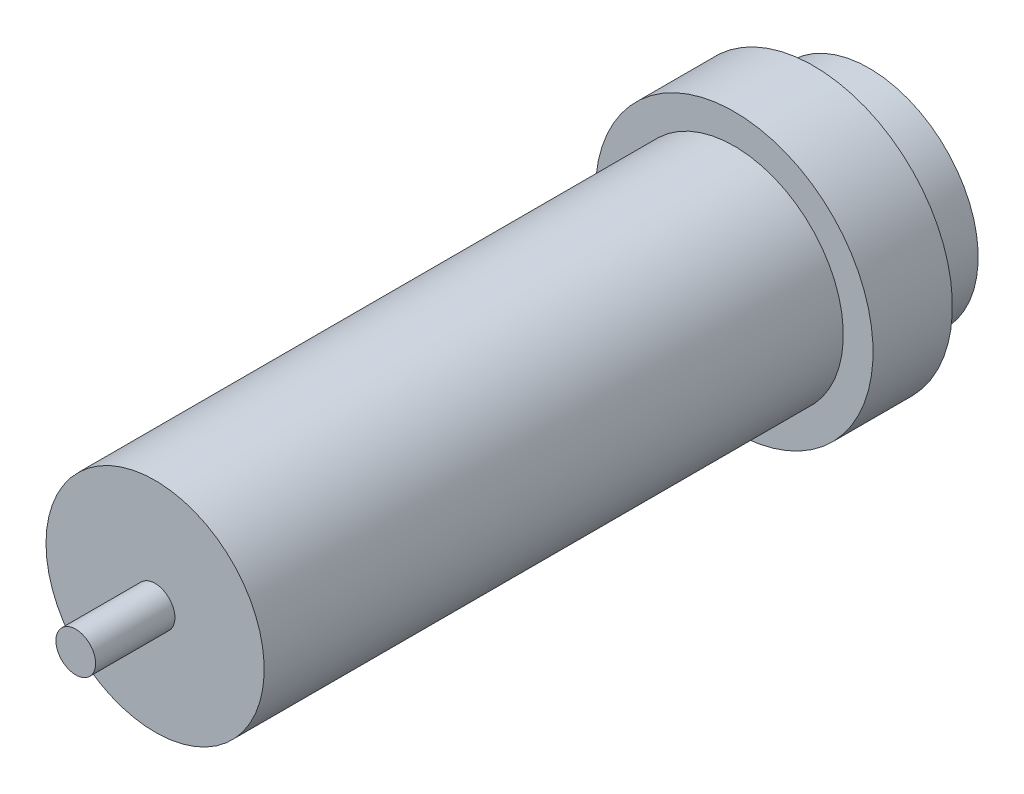
ISO-10303-21;
HEADER;
FILE_DESCRIPTION(('STEP AP214'),'2;1');
FILE_NAME('part.step','',(''),(''),'','','');
FILE_SCHEMA(('AUTOMOTIVE_DESIGN { 1 0 10303 214 1 1 1 1 }'));
ENDSEC;
DATA;
#1=APPLICATION_CONTEXT('core data for automotive mechanical design processes');
#2=APPLICATION_PROTOCOL_DEFINITION('international standard','automotive_design',2000,#1);
#3=PRODUCT_CONTEXT('',#1,'mechanical');
#4=PRODUCT('Part','Part','',(#3));
#5=PRODUCT_RELATED_PRODUCT_CATEGORY('part','',(#4));
#6=PRODUCT_DEFINITION_FORMATION('','',#4);
#7=PRODUCT_DEFINITION_CONTEXT('part definition',#1,'design');
#8=PRODUCT_DEFINITION('design','',#6,#7);
#9=PRODUCT_DEFINITION_SHAPE('','',#8);
#10=(LENGTH_UNIT() NAMED_UNIT(*) SI_UNIT(.MILLI.,.METRE.));
#11=(NAMED_UNIT(*) PLANE_ANGLE_UNIT() SI_UNIT($,.RADIAN.));
#12=(NAMED_UNIT(*) SI_UNIT($,.STERADIAN.) SOLID_ANGLE_UNIT());
#13=UNCERTAINTY_MEASURE_WITH_UNIT(LENGTH_MEASURE(1.E-05),#10,'distance_accuracy_value','');
#14=(GEOMETRIC_REPRESENTATION_CONTEXT(3) GLOBAL_UNCERTAINTY_ASSIGNED_CONTEXT((#13)) GLOBAL_UNIT_ASSIGNED_CONTEXT((#10,
#11,#12)) REPRESENTATION_CONTEXT('',''));
#15=CARTESIAN_POINT('',(0.,0.,0.));
#16=DIRECTION('',(0.,0.,1.));
#17=DIRECTION('',(1.,0.,0.));
#18=AXIS2_PLACEMENT_3D('',#15,#16,#17);
#19=CARTESIAN_POINT('',(0.,0.,2.5));
#20=DIRECTION('',(0.,0.,-1.));
#21=DIRECTION('',(-1.,0.,0.));
#22=AXIS2_PLACEMENT_3D('',#19,#20,#21);
#23=CYLINDRICAL_SURFACE('',#22,1.25);
#24=CARTESIAN_POINT('',(0.,0.,2.5));
#25=DIRECTION('',(0.,0.,1.));
#26=DIRECTION('',(1.,0.,0.));
#27=AXIS2_PLACEMENT_3D('',#24,#25,#26);
#28=CIRCLE('',#27,1.25);
#29=CARTESIAN_POINT('',(1.25,0.,2.5));
#30=VERTEX_POINT('',#29);
#31=EDGE_CURVE('E44',#30,#30,#28,.T.);
#32=ORIENTED_EDGE('',*,*,#31,.F.);
#33=EDGE_LOOP('',(#32));
#34=FACE_BOUND('',#33,.T.);
#35=CARTESIAN_POINT('',(0.,0.,0.));
#36=DIRECTION('',(0.,0.,1.));
#37=DIRECTION('',(1.,0.,0.));
#38=AXIS2_PLACEMENT_3D('',#35,#36,#37);
#39=CIRCLE('',#38,1.25);
#40=CARTESIAN_POINT('',(1.25,0.,0.));
#41=VERTEX_POINT('',#40);
#42=EDGE_CURVE('E58',#41,#41,#39,.T.);
#43=ORIENTED_EDGE('',*,*,#42,.T.);
#44=EDGE_LOOP('',(#43));
#45=FACE_BOUND('',#44,.T.);
#46=ADVANCED_FACE('F33',(#34,#45),#23,.T.);
#47=CARTESIAN_POINT('',(0.,0.,0.));
#48=DIRECTION('',(0.,0.,1.));
#49=DIRECTION('',(1.,0.,0.));
#50=AXIS2_PLACEMENT_3D('',#47,#48,#49);
#51=PLANE('',#50);
#52=ORIENTED_EDGE('',*,*,#42,.F.);
#53=EDGE_LOOP('',(#52));
#54=FACE_BOUND('',#53,.T.);
#55=ADVANCED_FACE('F94',(#54),#51,.F.);
#56=CARTESIAN_POINT('',(0.,0.,47.5));
#57=DIRECTION('',(0.,0.,-1.));
#58=DIRECTION('',(-1.,0.,0.));
#59=AXIS2_PLACEMENT_3D('',#56,#57,#58);
#60=CYLINDRICAL_SURFACE('',#59,6.875);
#61=CARTESIAN_POINT('',(0.,0.,6.));
#62=DIRECTION('',(0.,0.,-1.));
#63=DIRECTION('',(-1.,0.,0.));
#64=AXIS2_PLACEMENT_3D('',#61,#62,#63);
#65=CIRCLE('',#64,6.875);
#66=CARTESIAN_POINT('',(-6.875,0.,6.));
#67=VERTEX_POINT('',#66);
#68=EDGE_CURVE('E54',#67,#67,#65,.T.);
#69=CARTESIAN_POINT('',(0.,0.,2.5));
#70=DIRECTION('',(0.,0.,1.));
#71=DIRECTION('',(1.,0.,0.));
#72=AXIS2_PLACEMENT_3D('',#69,#70,#71);
#73=CIRCLE('',#72,6.875);
#74=CARTESIAN_POINT('',(-6.875,0.,2.5));
#75=VERTEX_POINT('',#74);
#76=EDGE_CURVE('E59',#75,#75,#73,.T.);
#77=CARTESIAN_POINT('',(-6.875,0.,6.));
#78=CARTESIAN_POINT('',(-6.875,0.,5.96354166666666));
#79=CARTESIAN_POINT('',(-6.875,0.,5.92708333333333));
#80=CARTESIAN_POINT('',(-6.875,0.,5.85416666666666));
#81=CARTESIAN_POINT('',(-6.875,0.,5.81770833333333));
#82=CARTESIAN_POINT('',(-6.875,0.,5.74479166666666));
#83=CARTESIAN_POINT('',(-6.875,0.,5.70833333333333));
#84=CARTESIAN_POINT('',(-6.875,0.,5.63541666666667));
#85=CARTESIAN_POINT('',(-6.875,0.,5.59895833333333));
#86=CARTESIAN_POINT('',(-6.875,0.,5.52604166666666));
#87=CARTESIAN_POINT('',(-6.875,0.,5.48958333333333));
#88=CARTESIAN_POINT('',(-6.875,0.,5.41666666666666));
#89=CARTESIAN_POINT('',(-6.875,0.,5.38020833333333));
#90=CARTESIAN_POINT('',(-6.875,0.,5.30729166666667));
#91=CARTESIAN_POINT('',(-6.875,0.,5.27083333333333));
#92=CARTESIAN_POINT('',(-6.875,0.,5.19791666666667));
#93=CARTESIAN_POINT('',(-6.875,0.,5.16145833333333));
#94=CARTESIAN_POINT('',(-6.875,0.,5.08854166666666));
#95=CARTESIAN_POINT('',(-6.875,0.,5.05208333333333));
#96=CARTESIAN_POINT('',(-6.875,0.,4.97916666666666));
#97=CARTESIAN_POINT('',(-6.875,0.,4.94270833333333));
#98=CARTESIAN_POINT('',(-6.875,0.,4.86979166666666));
#99=CARTESIAN_POINT('',(-6.875,0.,4.83333333333333));
#100=CARTESIAN_POINT('',(-6.875,0.,4.76041666666667));
#101=CARTESIAN_POINT('',(-6.875,0.,4.72395833333333));
#102=CARTESIAN_POINT('',(-6.875,0.,4.65104166666666));
#103=CARTESIAN_POINT('',(-6.875,0.,4.61458333333333));
#104=CARTESIAN_POINT('',(-6.875,0.,4.54166666666666));
#105=CARTESIAN_POINT('',(-6.875,0.,4.50520833333333));
#106=CARTESIAN_POINT('',(-6.875,0.,4.43229166666667));
#107=CARTESIAN_POINT('',(-6.875,0.,4.39583333333333));
#108=CARTESIAN_POINT('',(-6.875,0.,4.32291666666667));
#109=CARTESIAN_POINT('',(-6.875,0.,4.28645833333333));
#110=CARTESIAN_POINT('',(-6.875,0.,4.21354166666666));
#111=CARTESIAN_POINT('',(-6.875,0.,4.17708333333333));
#112=CARTESIAN_POINT('',(-6.875,0.,4.10416666666666));
#113=CARTESIAN_POINT('',(-6.875,0.,4.06770833333333));
#114=CARTESIAN_POINT('',(-6.875,0.,3.99479166666666));
#115=CARTESIAN_POINT('',(-6.875,0.,3.95833333333333));
#116=CARTESIAN_POINT('',(-6.875,0.,3.88541666666666));
#117=CARTESIAN_POINT('',(-6.875,0.,3.84895833333333));
#118=CARTESIAN_POINT('',(-6.875,0.,3.77604166666666));
#119=CARTESIAN_POINT('',(-6.875,0.,3.73958333333333));
#120=CARTESIAN_POINT('',(-6.875,0.,3.66666666666666));
#121=CARTESIAN_POINT('',(-6.875,0.,3.63020833333333));
#122=CARTESIAN_POINT('',(-6.875,0.,3.55729166666667));
#123=CARTESIAN_POINT('',(-6.875,0.,3.52083333333333));
#124=CARTESIAN_POINT('',(-6.875,0.,3.44791666666666));
#125=CARTESIAN_POINT('',(-6.875,0.,3.41145833333333));
#126=CARTESIAN_POINT('',(-6.875,0.,3.33854166666666));
#127=CARTESIAN_POINT('',(-6.875,0.,3.30208333333333));
#128=CARTESIAN_POINT('',(-6.875,0.,3.22916666666666));
#129=CARTESIAN_POINT('',(-6.875,0.,3.19270833333333));
#130=CARTESIAN_POINT('',(-6.875,0.,3.11979166666666));
#131=CARTESIAN_POINT('',(-6.875,0.,3.08333333333333));
#132=CARTESIAN_POINT('',(-6.875,0.,3.01041666666666));
#133=CARTESIAN_POINT('',(-6.875,0.,2.97395833333333));
#134=CARTESIAN_POINT('',(-6.875,0.,2.90104166666666));
#135=CARTESIAN_POINT('',(-6.875,0.,2.86458333333333));
#136=CARTESIAN_POINT('',(-6.875,0.,2.79166666666666));
#137=CARTESIAN_POINT('',(-6.875,0.,2.75520833333333));
#138=CARTESIAN_POINT('',(-6.875,0.,2.68229166666666));
#139=CARTESIAN_POINT('',(-6.875,0.,2.64583333333333));
#140=CARTESIAN_POINT('',(-6.875,0.,2.57291666666666));
#141=CARTESIAN_POINT('',(-6.875,0.,2.53645833333333));
#142=CARTESIAN_POINT('',(-6.875,0.,2.5));
#143=B_SPLINE_CURVE_WITH_KNOTS('',3,(#77,#78,#79,#80,#81,#82,#83,#84,#85,#86,#87,#88,#89,#90,
#91,#92,#93,#94,#95,#96,#97,#98,#99,#100,#101,#102,#103,#104,#105,#106,#107,#108,#109,#110,#111,
#112,#113,#114,#115,#116,#117,#118,#119,#120,#121,#122,#123,#124,#125,#126,#127,#128,#129,#130,
#131,#132,#133,#134,#135,#136,#137,#138,#139,#140,#141,#142),.UNSPECIFIED.,.F.,.F.,(4,2,2,2,2,2,
2,2,2,2,2,2,2,2,2,2,2,2,2,2,2,2,2,2,2,2,2,2,2,2,2,2,4),(0.,0.109375000000002,0.218750000000004,
0.328124999999999,0.4375,0.546875000000002,0.656249999999997,0.765624999999999,
0.875000000000001,0.984375000000003,1.09375,1.203125,1.3125,1.421875,1.53125,1.640625,1.75,
1.859375,1.96875000000001,2.078125,2.1875,2.296875,2.40625,2.515625,2.625,2.734375,
2.84375000000001,2.953125,3.0625,3.171875,3.28125,3.390625,3.5),.UNSPECIFIED.);
#144=EDGE_CURVE('BSEAM68',#67,#75,#143,.T.);
#145=ORIENTED_EDGE('',*,*,#68,.T.);
#146=ORIENTED_EDGE('',*,*,#76,.T.);
#147=ORIENTED_EDGE('',*,*,#144,.T.);
#148=ORIENTED_EDGE('',*,*,#144,.F.);
#149=EDGE_LOOP('',(#145,#147,#146,#148));
#150=FACE_BOUND('',#149,.T.);
#151=ADVANCED_FACE('F68',(#150),#60,.T.);
#152=CARTESIAN_POINT('',(0.,0.,2.5));
#153=DIRECTION('',(0.,0.,1.));
#154=DIRECTION('',(1.,0.,0.));
#155=AXIS2_PLACEMENT_3D('',#152,#153,#154);
#156=PLANE('',#155);
#157=ORIENTED_EDGE('',*,*,#31,.T.);
#158=EDGE_LOOP('',(#157));
#159=FACE_BOUND('',#158,.T.);
#160=ORIENTED_EDGE('',*,*,#76,.F.);
#161=EDGE_LOOP('',(#160));
#162=FACE_BOUND('',#161,.T.);
#163=ADVANCED_FACE('F81',(#159,#162),#156,.F.);
#164=CARTESIAN_POINT('',(0.,0.,11.));
#165=DIRECTION('',(0.,0.,-1.));
#166=DIRECTION('',(-1.,0.,0.));
#167=AXIS2_PLACEMENT_3D('',#164,#165,#166);
#168=CYLINDRICAL_SURFACE('',#167,8.75);
#169=CARTESIAN_POINT('',(0.,0.,11.));
#170=DIRECTION('',(0.,0.,-1.));
#171=DIRECTION('',(-1.,0.,0.));
#172=AXIS2_PLACEMENT_3D('',#169,#170,#171);
#173=CIRCLE('',#172,8.75);
#174=CARTESIAN_POINT('',(-8.75,0.,11.));
#175=VERTEX_POINT('',#174);
#176=EDGE_CURVE('E51',#175,#175,#173,.T.);
#177=ORIENTED_EDGE('',*,*,#176,.T.);
#178=EDGE_LOOP('',(#177));
#179=FACE_BOUND('',#178,.T.);
#180=CARTESIAN_POINT('',(0.,0.,6.));
#181=DIRECTION('',(0.,0.,-1.));
#182=DIRECTION('',(-1.,0.,0.));
#183=AXIS2_PLACEMENT_3D('',#180,#181,#182);
#184=CIRCLE('',#183,8.75);
#185=CARTESIAN_POINT('',(-8.75,0.,6.));
#186=VERTEX_POINT('',#185);
#187=EDGE_CURVE('E48',#186,#186,#184,.T.);
#188=ORIENTED_EDGE('',*,*,#187,.F.);
#189=EDGE_LOOP('',(#188));
#190=FACE_BOUND('',#189,.T.);
#191=ADVANCED_FACE('F79',(#179,#190),#168,.T.);
#192=CARTESIAN_POINT('',(0.,0.,11.));
#193=DIRECTION('',(0.,0.,-1.));
#194=DIRECTION('',(-1.,0.,0.));
#195=AXIS2_PLACEMENT_3D('',#192,#193,#194);
#196=PLANE('',#195);
#197=CARTESIAN_POINT('',(0.,0.,11.));
#198=DIRECTION('',(0.,0.,-1.));
#199=DIRECTION('',(-1.,0.,0.));
#200=AXIS2_PLACEMENT_3D('',#197,#198,#199);
#201=CIRCLE('',#200,6.875);
#202=CARTESIAN_POINT('',(-6.875,0.,11.));
#203=VERTEX_POINT('',#202);
#204=EDGE_CURVE('E36',#203,#203,#201,.T.);
#205=ORIENTED_EDGE('',*,*,#204,.T.);
#206=EDGE_LOOP('',(#205));
#207=FACE_BOUND('',#206,.T.);
#208=ORIENTED_EDGE('',*,*,#176,.F.);
#209=EDGE_LOOP('',(#208));
#210=FACE_BOUND('',#209,.T.);
#211=ADVANCED_FACE('F75',(#207,#210),#196,.F.);
#212=CARTESIAN_POINT('',(0.,0.,6.));
#213=DIRECTION('',(0.,0.,-1.));
#214=DIRECTION('',(-1.,0.,0.));
#215=AXIS2_PLACEMENT_3D('',#212,#213,#214);
#216=PLANE('',#215);
#217=ORIENTED_EDGE('',*,*,#68,.F.);
#218=EDGE_LOOP('',(#217));
#219=FACE_BOUND('',#218,.T.);
#220=ORIENTED_EDGE('',*,*,#187,.T.);
#221=EDGE_LOOP('',(#220));
#222=FACE_BOUND('',#221,.T.);
#223=ADVANCED_FACE('F71',(#219,#222),#216,.T.);
#224=CARTESIAN_POINT('',(0.,0.,47.5));
#225=DIRECTION('',(0.,0.,1.));
#226=DIRECTION('',(1.,0.,0.));
#227=AXIS2_PLACEMENT_3D('',#224,#225,#226);
#228=PLANE('',#227);
#229=CARTESIAN_POINT('',(0.,0.,47.5));
#230=DIRECTION('',(0.,0.,1.));
#231=DIRECTION('',(1.,0.,0.));
#232=AXIS2_PLACEMENT_3D('',#229,#230,#231);
#233=CIRCLE('',#232,1.25);
#234=CARTESIAN_POINT('',(1.25,0.,47.5));
#235=VERTEX_POINT('',#234);
#236=EDGE_CURVE('E10',#235,#235,#233,.T.);
#237=ORIENTED_EDGE('',*,*,#236,.F.);
#238=EDGE_LOOP('',(#237));
#239=FACE_BOUND('',#238,.T.);
#240=CARTESIAN_POINT('',(0.,0.,47.5));
#241=DIRECTION('',(0.,0.,1.));
#242=DIRECTION('',(1.,0.,0.));
#243=AXIS2_PLACEMENT_3D('',#240,#241,#242);
#244=CIRCLE('',#243,6.875);
#245=CARTESIAN_POINT('',(-6.875,0.,47.5));
#246=VERTEX_POINT('',#245);
#247=EDGE_CURVE('E55',#246,#246,#244,.T.);
#248=ORIENTED_EDGE('',*,*,#247,.T.);
#249=EDGE_LOOP('',(#248));
#250=FACE_BOUND('',#249,.T.);
#251=ADVANCED_FACE('F74',(#239,#250),#228,.T.);
#252=CARTESIAN_POINT('',(-6.875,0.,47.5));
#253=CARTESIAN_POINT('',(-6.875,0.,47.1197916666667));
#254=CARTESIAN_POINT('',(-6.875,0.,46.7395833333333));
#255=CARTESIAN_POINT('',(-6.875,0.,45.9791666666667));
#256=CARTESIAN_POINT('',(-6.875,0.,45.5989583333333));
#257=CARTESIAN_POINT('',(-6.875,0.,44.8385416666667));
#258=CARTESIAN_POINT('',(-6.875,0.,44.4583333333333));
#259=CARTESIAN_POINT('',(-6.875,0.,43.6979166666667));
#260=CARTESIAN_POINT('',(-6.875,0.,43.3177083333333));
#261=CARTESIAN_POINT('',(-6.875,0.,42.5572916666667));
#262=CARTESIAN_POINT('',(-6.875,0.,42.1770833333333));
#263=CARTESIAN_POINT('',(-6.875,0.,41.4166666666667));
#264=CARTESIAN_POINT('',(-6.875,0.,41.0364583333333));
#265=CARTESIAN_POINT('',(-6.875,0.,40.2760416666667));
#266=CARTESIAN_POINT('',(-6.875,0.,39.8958333333333));
#267=CARTESIAN_POINT('',(-6.875,0.,39.1354166666667));
#268=CARTESIAN_POINT('',(-6.875,0.,38.7552083333333));
#269=CARTESIAN_POINT('',(-6.875,0.,37.9947916666667));
#270=CARTESIAN_POINT('',(-6.875,0.,37.6145833333333));
#271=CARTESIAN_POINT('',(-6.875,0.,36.8541666666667));
#272=CARTESIAN_POINT('',(-6.875,0.,36.4739583333333));
#273=CARTESIAN_POINT('',(-6.875,0.,35.7135416666667));
#274=CARTESIAN_POINT('',(-6.875,0.,35.3333333333333));
#275=CARTESIAN_POINT('',(-6.875,0.,34.5729166666667));
#276=CARTESIAN_POINT('',(-6.875,0.,34.1927083333333));
#277=CARTESIAN_POINT('',(-6.875,0.,33.4322916666667));
#278=CARTESIAN_POINT('',(-6.875,0.,33.0520833333333));
#279=CARTESIAN_POINT('',(-6.875,0.,32.2916666666667));
#280=CARTESIAN_POINT('',(-6.875,0.,31.9114583333333));
#281=CARTESIAN_POINT('',(-6.875,0.,31.1510416666667));
#282=CARTESIAN_POINT('',(-6.875,0.,30.7708333333333));
#283=CARTESIAN_POINT('',(-6.875,0.,30.0104166666667));
#284=CARTESIAN_POINT('',(-6.875,0.,29.6302083333333));
#285=CARTESIAN_POINT('',(-6.875,0.,28.8697916666667));
#286=CARTESIAN_POINT('',(-6.875,0.,28.4895833333333));
#287=CARTESIAN_POINT('',(-6.875,0.,27.7291666666667));
#288=CARTESIAN_POINT('',(-6.875,0.,27.3489583333333));
#289=CARTESIAN_POINT('',(-6.875,0.,26.5885416666667));
#290=CARTESIAN_POINT('',(-6.875,0.,26.2083333333333));
#291=CARTESIAN_POINT('',(-6.875,0.,25.4479166666667));
#292=CARTESIAN_POINT('',(-6.875,0.,25.0677083333333));
#293=CARTESIAN_POINT('',(-6.875,0.,24.3072916666667));
#294=CARTESIAN_POINT('',(-6.875,0.,23.9270833333333));
#295=CARTESIAN_POINT('',(-6.875,0.,23.1666666666667));
#296=CARTESIAN_POINT('',(-6.875,0.,22.7864583333333));
#297=CARTESIAN_POINT('',(-6.875,0.,22.0260416666667));
#298=CARTESIAN_POINT('',(-6.875,0.,21.6458333333333));
#299=CARTESIAN_POINT('',(-6.875,0.,20.8854166666667));
#300=CARTESIAN_POINT('',(-6.875,0.,20.5052083333333));
#301=CARTESIAN_POINT('',(-6.875,0.,19.7447916666667));
#302=CARTESIAN_POINT('',(-6.875,0.,19.3645833333333));
#303=CARTESIAN_POINT('',(-6.875,0.,18.6041666666667));
#304=CARTESIAN_POINT('',(-6.875,0.,18.2239583333333));
#305=CARTESIAN_POINT('',(-6.875,0.,17.4635416666667));
#306=CARTESIAN_POINT('',(-6.875,0.,17.0833333333333));
#307=CARTESIAN_POINT('',(-6.875,0.,16.3229166666667));
#308=CARTESIAN_POINT('',(-6.875,0.,15.9427083333333));
#309=CARTESIAN_POINT('',(-6.875,0.,15.1822916666667));
#310=CARTESIAN_POINT('',(-6.875,0.,14.8020833333333));
#311=CARTESIAN_POINT('',(-6.875,0.,14.0416666666667));
#312=CARTESIAN_POINT('',(-6.875,0.,13.6614583333333));
#313=CARTESIAN_POINT('',(-6.875,0.,12.9010416666667));
#314=CARTESIAN_POINT('',(-6.875,0.,12.5208333333333));
#315=CARTESIAN_POINT('',(-6.875,0.,11.7604166666667));
#316=CARTESIAN_POINT('',(-6.875,0.,11.3802083333333));
#317=CARTESIAN_POINT('',(-6.875,0.,11.));
#318=B_SPLINE_CURVE_WITH_KNOTS('',3,(#252,#253,#254,#255,#256,#257,#258,#259,#260,#261,#262,
#263,#264,#265,#266,#267,#268,#269,#270,#271,#272,#273,#274,#275,#276,#277,#278,#279,#280,#281,
#282,#283,#284,#285,#286,#287,#288,#289,#290,#291,#292,#293,#294,#295,#296,#297,#298,#299,#300,
#301,#302,#303,#304,#305,#306,#307,#308,#309,#310,#311,#312,#313,#314,#315,#316,#317),
.UNSPECIFIED.,.F.,.F.,(4,2,2,2,2,2,2,2,2,2,2,2,2,2,2,2,2,2,2,2,2,2,2,2,2,2,2,2,2,2,2,2,4),(0.,
1.14062500000001,2.28125000000001,3.421875,4.5625,5.703125,6.84375,7.984375,9.125,10.265625,
11.40625,12.546875,13.6875,14.828125,15.96875,17.109375,18.25,19.390625,20.53125,21.671875,
22.8125,23.953125,25.09375,26.234375,27.375,28.515625,29.65625,30.796875,31.9375,33.078125,
34.21875,35.359375,36.5),.UNSPECIFIED.);
#319=EDGE_CURVE('BSEAM107',#246,#203,#318,.T.);
#320=ORIENTED_EDGE('',*,*,#247,.F.);
#321=ORIENTED_EDGE('',*,*,#204,.F.);
#322=ORIENTED_EDGE('',*,*,#319,.T.);
#323=ORIENTED_EDGE('',*,*,#319,.F.);
#324=EDGE_LOOP('',(#320,#322,#321,#323));
#325=FACE_BOUND('',#324,.T.);
#326=ADVANCED_FACE('F107',(#325),#60,.T.);
#327=CARTESIAN_POINT('',(0.,0.,52.5));
#328=DIRECTION('',(0.,0.,-1.));
#329=DIRECTION('',(-1.,0.,0.));
#330=AXIS2_PLACEMENT_3D('',#327,#328,#329);
#331=CYLINDRICAL_SURFACE('',#330,1.25);
#332=CARTESIAN_POINT('',(0.,0.,52.5));
#333=DIRECTION('',(0.,0.,1.));
#334=DIRECTION('',(1.,0.,0.));
#335=AXIS2_PLACEMENT_3D('',#332,#333,#334);
#336=CIRCLE('',#335,1.25);
#337=CARTESIAN_POINT('',(1.25,0.,52.5));
#338=VERTEX_POINT('',#337);
#339=EDGE_CURVE('E47',#338,#338,#336,.T.);
#340=ORIENTED_EDGE('',*,*,#339,.F.);
#341=EDGE_LOOP('',(#340));
#342=FACE_BOUND('',#341,.T.);
#343=ORIENTED_EDGE('',*,*,#236,.T.);
#344=EDGE_LOOP('',(#343));
#345=FACE_BOUND('',#344,.T.);
#346=ADVANCED_FACE('F111',(#342,#345),#331,.T.);
#347=CARTESIAN_POINT('',(0.,0.,52.5));
#348=DIRECTION('',(0.,0.,1.));
#349=DIRECTION('',(1.,0.,0.));
#350=AXIS2_PLACEMENT_3D('',#347,#348,#349);
#351=PLANE('',#350);
#352=ORIENTED_EDGE('',*,*,#339,.T.);
#353=EDGE_LOOP('',(#352));
#354=FACE_BOUND('',#353,.T.);
#355=ADVANCED_FACE('F117',(#354),#351,.T.);
#356=CLOSED_SHELL('',(#46,#55,#151,#163,#191,#211,#223,#251,#326,#346,#355));
#357=MANIFOLD_SOLID_BREP('B2',#356);
#358=ADVANCED_BREP_SHAPE_REPRESENTATION('',(#18,#357),#14);
#359=SHAPE_DEFINITION_REPRESENTATION(#9,#358);
ENDSEC;
END-ISO-10303-21;
